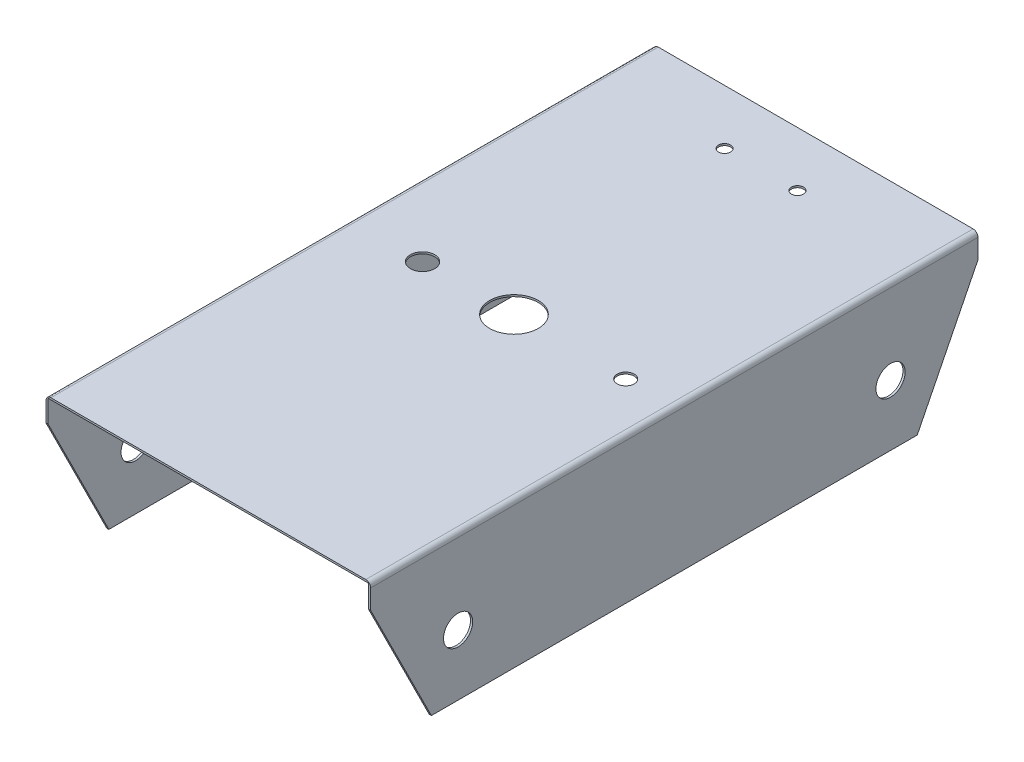
ISO-10303-21;
HEADER;
FILE_DESCRIPTION(('STEP AP214'),'2;1');
FILE_NAME('part.step','',(''),(''),'','','');
FILE_SCHEMA(('AUTOMOTIVE_DESIGN { 1 0 10303 214 1 1 1 1 }'));
ENDSEC;
DATA;
#1=APPLICATION_CONTEXT('core data for automotive mechanical design processes');
#2=APPLICATION_PROTOCOL_DEFINITION('international standard','automotive_design',2000,#1);
#3=PRODUCT_CONTEXT('',#1,'mechanical');
#4=PRODUCT('Part','Part','',(#3));
#5=PRODUCT_RELATED_PRODUCT_CATEGORY('part','',(#4));
#6=PRODUCT_DEFINITION_FORMATION('','',#4);
#7=PRODUCT_DEFINITION_CONTEXT('part definition',#1,'design');
#8=PRODUCT_DEFINITION('design','',#6,#7);
#9=PRODUCT_DEFINITION_SHAPE('','',#8);
#10=(LENGTH_UNIT() NAMED_UNIT(*) SI_UNIT(.MILLI.,.METRE.));
#11=(NAMED_UNIT(*) PLANE_ANGLE_UNIT() SI_UNIT($,.RADIAN.));
#12=(NAMED_UNIT(*) SI_UNIT($,.STERADIAN.) SOLID_ANGLE_UNIT());
#13=UNCERTAINTY_MEASURE_WITH_UNIT(LENGTH_MEASURE(1.E-05),#10,'distance_accuracy_value','');
#14=(GEOMETRIC_REPRESENTATION_CONTEXT(3) GLOBAL_UNCERTAINTY_ASSIGNED_CONTEXT((#13)) GLOBAL_UNIT_ASSIGNED_CONTEXT((#10,
#11,#12)) REPRESENTATION_CONTEXT('',''));
#15=CARTESIAN_POINT('',(0.,0.,0.));
#16=DIRECTION('',(0.,0.,1.));
#17=DIRECTION('',(1.,0.,0.));
#18=AXIS2_PLACEMENT_3D('',#15,#16,#17);
#19=CARTESIAN_POINT('',(-65.93,-60.,250.));
#20=DIRECTION('',(0.,1.,0.));
#21=DIRECTION('',(0.,0.,1.));
#22=AXIS2_PLACEMENT_3D('',#19,#20,#21);
#23=PLANE('',#22);
#24=DIRECTION('',(1.,0.,0.));
#25=VECTOR('',#24,1.);
#26=CARTESIAN_POINT('',(-183.19,-60.0000000000001,225.));
#27=LINE('',#26,#25);
#28=CARTESIAN_POINT('',(-66.81,-60.0000000000001,225.));
#29=VERTEX_POINT('',#28);
#30=CARTESIAN_POINT('',(-65.93,-60.0000000000001,225.));
#31=VERTEX_POINT('',#30);
#32=EDGE_CURVE('E148',#29,#31,#27,.T.);
#33=ORIENTED_EDGE('',*,*,#32,.F.);
#34=DIRECTION('',(0.,0.,-1.));
#35=VECTOR('',#34,1.);
#36=CARTESIAN_POINT('',(-66.81,-60.,250.));
#37=LINE('',#36,#35);
#38=CARTESIAN_POINT('',(-66.81,-60.0000000000001,25.));
#39=VERTEX_POINT('',#38);
#40=EDGE_CURVE('E161',#29,#39,#37,.T.);
#41=ORIENTED_EDGE('',*,*,#40,.T.);
#42=DIRECTION('',(1.,0.,0.));
#43=VECTOR('',#42,1.);
#44=CARTESIAN_POINT('',(-183.19,-60.0000000000001,25.));
#45=LINE('',#44,#43);
#46=CARTESIAN_POINT('',(-65.93,-60.0000000000001,25.));
#47=VERTEX_POINT('',#46);
#48=EDGE_CURVE('E155',#39,#47,#45,.T.);
#49=ORIENTED_EDGE('',*,*,#48,.T.);
#50=DIRECTION('',(0.,0.,-1.));
#51=VECTOR('',#50,1.);
#52=CARTESIAN_POINT('',(-65.93,-60.,250.));
#53=LINE('',#52,#51);
#54=EDGE_CURVE('E175',#31,#47,#53,.T.);
#55=ORIENTED_EDGE('',*,*,#54,.F.);
#56=EDGE_LOOP('',(#33,#41,#49,#55));
#57=FACE_BOUND('',#56,.T.);
#58=ADVANCED_FACE('F33',(#57),#23,.F.);
#59=CARTESIAN_POINT('',(-65.93,-0.750000000000023,250.));
#60=DIRECTION('',(-1.,0.,0.));
#61=DIRECTION('',(0.,-1.,0.));
#62=AXIS2_PLACEMENT_3D('',#59,#60,#61);
#63=PLANE('',#62);
#64=CARTESIAN_POINT('',(-65.93,-55.7,93.));
#65=DIRECTION('',(1.,0.,0.));
#66=DIRECTION('',(0.,1.,0.));
#67=AXIS2_PLACEMENT_3D('',#64,#65,#66);
#68=CIRCLE('',#67,2.5);
#69=CARTESIAN_POINT('',(-65.93,-53.2,93.));
#70=VERTEX_POINT('',#69);
#71=EDGE_CURVE('E627',#70,#70,#68,.T.);
#72=ORIENTED_EDGE('',*,*,#71,.F.);
#73=EDGE_LOOP('',(#72));
#74=FACE_BOUND('',#73,.T.);
#75=CARTESIAN_POINT('',(-65.93,-5.70000000000004,173.));
#76=DIRECTION('',(1.,0.,0.));
#77=DIRECTION('',(0.,1.,0.));
#78=AXIS2_PLACEMENT_3D('',#75,#76,#77);
#79=CIRCLE('',#78,2.5);
#80=CARTESIAN_POINT('',(-65.93,-3.20000000000005,173.));
#81=VERTEX_POINT('',#80);
#82=EDGE_CURVE('E626',#81,#81,#79,.T.);
#83=ORIENTED_EDGE('',*,*,#82,.F.);
#84=EDGE_LOOP('',(#83));
#85=FACE_BOUND('',#84,.T.);
#86=CARTESIAN_POINT('',(-65.93,-5.70000000000004,93.));
#87=DIRECTION('',(1.,0.,0.));
#88=DIRECTION('',(0.,1.,0.));
#89=AXIS2_PLACEMENT_3D('',#86,#87,#88);
#90=CIRCLE('',#89,2.5);
#91=CARTESIAN_POINT('',(-65.93,-3.20000000000005,93.));
#92=VERTEX_POINT('',#91);
#93=EDGE_CURVE('E623',#92,#92,#90,.T.);
#94=ORIENTED_EDGE('',*,*,#93,.F.);
#95=EDGE_LOOP('',(#94));
#96=FACE_BOUND('',#95,.T.);
#97=CARTESIAN_POINT('',(-65.93,-55.7,173.));
#98=DIRECTION('',(1.,0.,0.));
#99=DIRECTION('',(0.,1.,0.));
#100=AXIS2_PLACEMENT_3D('',#97,#98,#99);
#101=CIRCLE('',#100,2.5);
#102=CARTESIAN_POINT('',(-65.93,-53.2,173.));
#103=VERTEX_POINT('',#102);
#104=EDGE_CURVE('E203',#103,#103,#101,.T.);
#105=ORIENTED_EDGE('',*,*,#104,.F.);
#106=EDGE_LOOP('',(#105));
#107=FACE_BOUND('',#106,.T.);
#108=CARTESIAN_POINT('',(-65.93,-35.,214.));
#109=DIRECTION('',(-1.,0.,0.));
#110=DIRECTION('',(0.,-1.,0.));
#111=AXIS2_PLACEMENT_3D('',#108,#109,#110);
#112=CIRCLE('',#111,6.00000000000002);
#113=CARTESIAN_POINT('',(-65.93,-41.0000000000001,214.));
#114=VERTEX_POINT('',#113);
#115=EDGE_CURVE('E244',#114,#114,#112,.T.);
#116=ORIENTED_EDGE('',*,*,#115,.T.);
#117=EDGE_LOOP('',(#116));
#118=FACE_BOUND('',#117,.T.);
#119=CARTESIAN_POINT('',(-65.93,-35.,36.));
#120=DIRECTION('',(-1.,0.,0.));
#121=DIRECTION('',(0.,-1.,0.));
#122=AXIS2_PLACEMENT_3D('',#119,#120,#121);
#123=CIRCLE('',#122,6.);
#124=CARTESIAN_POINT('',(-65.93,-41.,36.));
#125=VERTEX_POINT('',#124);
#126=EDGE_CURVE('E235',#125,#125,#123,.T.);
#127=ORIENTED_EDGE('',*,*,#126,.T.);
#128=EDGE_LOOP('',(#127));
#129=FACE_BOUND('',#128,.T.);
#130=DIRECTION('',(0.,0.894427190999916,0.447213595499958));
#131=VECTOR('',#130,1.);
#132=CARTESIAN_POINT('',(-65.93,-2.60000000000002,253.7));
#133=LINE('',#132,#131);
#134=CARTESIAN_POINT('',(-65.93,-10.,250.));
#135=VERTEX_POINT('',#134);
#136=EDGE_CURVE('E262',#31,#135,#133,.T.);
#137=ORIENTED_EDGE('',*,*,#136,.F.);
#138=ORIENTED_EDGE('',*,*,#54,.T.);
#139=DIRECTION('',(0.,0.894427190999916,-0.447213595499958));
#140=VECTOR('',#139,1.);
#141=CARTESIAN_POINT('',(-65.93,-102.6,46.3000000000001));
#142=LINE('',#141,#140);
#143=CARTESIAN_POINT('',(-65.93,-10.,0.));
#144=VERTEX_POINT('',#143);
#145=EDGE_CURVE('E256',#47,#144,#142,.T.);
#146=ORIENTED_EDGE('',*,*,#145,.T.);
#147=DIRECTION('',(0.,1.,0.));
#148=VECTOR('',#147,1.);
#149=CARTESIAN_POINT('',(-65.93,-0.750000000000023,0.));
#150=LINE('',#149,#148);
#151=CARTESIAN_POINT('',(-65.93,-0.750000000000023,0.));
#152=VERTEX_POINT('',#151);
#153=EDGE_CURVE('E264',#144,#152,#150,.T.);
#154=ORIENTED_EDGE('',*,*,#153,.T.);
#155=DIRECTION('',(0.,0.,-1.));
#156=VECTOR('',#155,1.);
#157=CARTESIAN_POINT('',(-65.93,-0.750000000000023,250.));
#158=LINE('',#157,#156);
#159=CARTESIAN_POINT('',(-65.93,-0.750000000000023,250.));
#160=VERTEX_POINT('',#159);
#161=EDGE_CURVE('E172',#160,#152,#158,.T.);
#162=ORIENTED_EDGE('',*,*,#161,.F.);
#163=DIRECTION('',(0.,1.,0.));
#164=VECTOR('',#163,1.);
#165=CARTESIAN_POINT('',(-65.93,-0.750000000000023,250.));
#166=LINE('',#165,#164);
#167=EDGE_CURVE('E265',#135,#160,#166,.T.);
#168=ORIENTED_EDGE('',*,*,#167,.F.);
#169=EDGE_LOOP('',(#137,#138,#146,#154,#162,#168));
#170=FACE_BOUND('',#169,.T.);
#171=ADVANCED_FACE('F305',(#74,#85,#96,#107,#118,#129,#170),#63,.F.);
#172=CARTESIAN_POINT('',(65.93,-60.,250.));
#173=DIRECTION('',(1.,0.,0.));
#174=DIRECTION('',(0.,0.,-1.));
#175=AXIS2_PLACEMENT_3D('',#172,#173,#174);
#176=PLANE('',#175);
#177=CARTESIAN_POINT('',(65.93,-35.,214.));
#178=DIRECTION('',(1.,0.,0.));
#179=DIRECTION('',(0.,0.,-1.));
#180=AXIS2_PLACEMENT_3D('',#177,#178,#179);
#181=CIRCLE('',#180,6.00000000000002);
#182=CARTESIAN_POINT('',(65.93,-35.,208.));
#183=VERTEX_POINT('',#182);
#184=EDGE_CURVE('E241',#183,#183,#181,.T.);
#185=ORIENTED_EDGE('',*,*,#184,.T.);
#186=EDGE_LOOP('',(#185));
#187=FACE_BOUND('',#186,.T.);
#188=CARTESIAN_POINT('',(65.93,-35.,36.));
#189=DIRECTION('',(1.,0.,0.));
#190=DIRECTION('',(0.,0.,-1.));
#191=AXIS2_PLACEMENT_3D('',#188,#189,#190);
#192=CIRCLE('',#191,6.);
#193=CARTESIAN_POINT('',(65.93,-35.,30.));
#194=VERTEX_POINT('',#193);
#195=EDGE_CURVE('E232',#194,#194,#192,.T.);
#196=ORIENTED_EDGE('',*,*,#195,.T.);
#197=EDGE_LOOP('',(#196));
#198=FACE_BOUND('',#197,.T.);
#199=DIRECTION('',(0.,-0.894427190999916,-0.447213595499958));
#200=VECTOR('',#199,1.);
#201=CARTESIAN_POINT('',(65.93,-50.,230.));
#202=LINE('',#201,#200);
#203=CARTESIAN_POINT('',(65.93,-10.,250.));
#204=VERTEX_POINT('',#203);
#205=CARTESIAN_POINT('',(65.93,-60.0000000000001,225.));
#206=VERTEX_POINT('',#205);
#207=EDGE_CURVE('E143',#204,#206,#202,.T.);
#208=ORIENTED_EDGE('',*,*,#207,.F.);
#209=DIRECTION('',(0.,-1.,0.));
#210=VECTOR('',#209,1.);
#211=CARTESIAN_POINT('',(65.93,-60.,250.));
#212=LINE('',#211,#210);
#213=CARTESIAN_POINT('',(65.93,-0.749999999999973,250.));
#214=VERTEX_POINT('',#213);
#215=EDGE_CURVE('E270',#214,#204,#212,.T.);
#216=ORIENTED_EDGE('',*,*,#215,.F.);
#217=DIRECTION('',(0.,0.,-1.));
#218=VECTOR('',#217,1.);
#219=CARTESIAN_POINT('',(65.93,-0.749999999999973,250.));
#220=LINE('',#219,#218);
#221=CARTESIAN_POINT('',(65.93,-0.749999999999973,0.));
#222=VERTEX_POINT('',#221);
#223=EDGE_CURVE('E163',#214,#222,#220,.T.);
#224=ORIENTED_EDGE('',*,*,#223,.T.);
#225=DIRECTION('',(0.,-1.,0.));
#226=VECTOR('',#225,1.);
#227=CARTESIAN_POINT('',(65.93,-60.,0.));
#228=LINE('',#227,#226);
#229=CARTESIAN_POINT('',(65.93,-10.,0.));
#230=VERTEX_POINT('',#229);
#231=EDGE_CURVE('E280',#222,#230,#228,.T.);
#232=ORIENTED_EDGE('',*,*,#231,.T.);
#233=DIRECTION('',(0.,-0.894427190999916,0.447213595499958));
#234=VECTOR('',#233,1.);
#235=CARTESIAN_POINT('',(65.93,-150.,70.0000000000001));
#236=LINE('',#235,#234);
#237=CARTESIAN_POINT('',(65.93,-60.0000000000001,25.));
#238=VERTEX_POINT('',#237);
#239=EDGE_CURVE('E253',#230,#238,#236,.T.);
#240=ORIENTED_EDGE('',*,*,#239,.T.);
#241=DIRECTION('',(0.,0.,-1.));
#242=VECTOR('',#241,1.);
#243=CARTESIAN_POINT('',(65.93,-60.,250.));
#244=LINE('',#243,#242);
#245=EDGE_CURVE('E160',#206,#238,#244,.T.);
#246=ORIENTED_EDGE('',*,*,#245,.F.);
#247=EDGE_LOOP('',(#208,#216,#224,#232,#240,#246));
#248=FACE_BOUND('',#247,.T.);
#249=ADVANCED_FACE('F336',(#187,#198,#248),#176,.F.);
#250=CARTESIAN_POINT('',(66.81,-60.0000000000001,250.));
#251=DIRECTION('',(0.,1.,0.));
#252=DIRECTION('',(-1.,0.,0.));
#253=AXIS2_PLACEMENT_3D('',#250,#251,#252);
#254=PLANE('',#253);
#255=CARTESIAN_POINT('',(66.81,-60.0000000000001,225.));
#256=VERTEX_POINT('',#255);
#257=EDGE_CURVE('E137',#206,#256,#27,.T.);
#258=ORIENTED_EDGE('',*,*,#257,.F.);
#259=ORIENTED_EDGE('',*,*,#245,.T.);
#260=CARTESIAN_POINT('',(66.81,-60.0000000000001,25.));
#261=VERTEX_POINT('',#260);
#262=EDGE_CURVE('E159',#238,#261,#45,.T.);
#263=ORIENTED_EDGE('',*,*,#262,.T.);
#264=DIRECTION('',(0.,0.,-1.));
#265=VECTOR('',#264,1.);
#266=CARTESIAN_POINT('',(66.81,-60.0000000000001,250.));
#267=LINE('',#266,#265);
#268=EDGE_CURVE('E153',#256,#261,#267,.T.);
#269=ORIENTED_EDGE('',*,*,#268,.F.);
#270=EDGE_LOOP('',(#258,#259,#263,#269));
#271=FACE_BOUND('',#270,.T.);
#272=ADVANCED_FACE('F158',(#271),#254,.F.);
#273=CARTESIAN_POINT('',(66.81,0.,250.));
#274=DIRECTION('',(-1.,0.,0.));
#275=DIRECTION('',(0.,-1.,0.));
#276=AXIS2_PLACEMENT_3D('',#273,#274,#275);
#277=PLANE('',#276);
#278=CARTESIAN_POINT('',(66.81,-35.,214.));
#279=DIRECTION('',(-1.,0.,0.));
#280=DIRECTION('',(0.,-1.,0.));
#281=AXIS2_PLACEMENT_3D('',#278,#279,#280);
#282=CIRCLE('',#281,6.00000000000002);
#283=CARTESIAN_POINT('',(66.81,-41.,214.));
#284=VERTEX_POINT('',#283);
#285=EDGE_CURVE('E238',#284,#284,#282,.T.);
#286=ORIENTED_EDGE('',*,*,#285,.T.);
#287=EDGE_LOOP('',(#286));
#288=FACE_BOUND('',#287,.T.);
#289=CARTESIAN_POINT('',(66.81,-35.,36.));
#290=DIRECTION('',(-1.,0.,0.));
#291=DIRECTION('',(0.,-1.,0.));
#292=AXIS2_PLACEMENT_3D('',#289,#290,#291);
#293=CIRCLE('',#292,6.);
#294=CARTESIAN_POINT('',(66.81,-41.,36.));
#295=VERTEX_POINT('',#294);
#296=EDGE_CURVE('E227',#295,#295,#293,.T.);
#297=ORIENTED_EDGE('',*,*,#296,.T.);
#298=EDGE_LOOP('',(#297));
#299=FACE_BOUND('',#298,.T.);
#300=DIRECTION('',(0.,1.,0.));
#301=VECTOR('',#300,1.);
#302=CARTESIAN_POINT('',(66.81,0.,0.));
#303=LINE('',#302,#301);
#304=CARTESIAN_POINT('',(66.81,-10.,0.));
#305=VERTEX_POINT('',#304);
#306=CARTESIAN_POINT('',(66.81,-2.00000000000006,0.));
#307=VERTEX_POINT('',#306);
#308=EDGE_CURVE('E283',#305,#307,#303,.T.);
#309=ORIENTED_EDGE('',*,*,#308,.T.);
#310=DIRECTION('',(0.,0.,-1.));
#311=VECTOR('',#310,1.);
#312=CARTESIAN_POINT('',(66.81,-2.00000000000006,250.));
#313=LINE('',#312,#311);
#314=CARTESIAN_POINT('',(66.81,-2.00000000000006,250.));
#315=VERTEX_POINT('',#314);
#316=EDGE_CURVE('E11',#307,#315,#313,.F.);
#317=ORIENTED_EDGE('',*,*,#316,.T.);
#318=DIRECTION('',(0.,1.,0.));
#319=VECTOR('',#318,1.);
#320=CARTESIAN_POINT('',(66.81,0.,250.));
#321=LINE('',#320,#319);
#322=CARTESIAN_POINT('',(66.81,-10.,250.));
#323=VERTEX_POINT('',#322);
#324=EDGE_CURVE('E154',#323,#315,#321,.T.);
#325=ORIENTED_EDGE('',*,*,#324,.F.);
#326=DIRECTION('',(0.,-0.894427190999916,-0.447213595499958));
#327=VECTOR('',#326,1.);
#328=CARTESIAN_POINT('',(66.81,-102.,204.));
#329=LINE('',#328,#327);
#330=EDGE_CURVE('E140',#323,#256,#329,.T.);
#331=ORIENTED_EDGE('',*,*,#330,.T.);
#332=ORIENTED_EDGE('',*,*,#268,.T.);
#333=DIRECTION('',(0.,-0.894427190999916,0.447213595499958));
#334=VECTOR('',#333,1.);
#335=CARTESIAN_POINT('',(66.81,-1.99999999999999,-4.00000000000001));
#336=LINE('',#335,#334);
#337=EDGE_CURVE('E246',#305,#261,#336,.T.);
#338=ORIENTED_EDGE('',*,*,#337,.F.);
#339=EDGE_LOOP('',(#309,#317,#325,#331,#332,#338));
#340=FACE_BOUND('',#339,.T.);
#341=ADVANCED_FACE('F151',(#288,#299,#340),#277,.F.);
#342=CARTESIAN_POINT('',(-66.81,-60.,250.));
#343=DIRECTION('',(1.,0.,0.));
#344=DIRECTION('',(0.,0.,-1.));
#345=AXIS2_PLACEMENT_3D('',#342,#343,#344);
#346=PLANE('',#345);
#347=CARTESIAN_POINT('',(-66.81,-55.7,93.));
#348=DIRECTION('',(1.,0.,0.));
#349=DIRECTION('',(0.,0.,-1.));
#350=AXIS2_PLACEMENT_3D('',#347,#348,#349);
#351=CIRCLE('',#350,2.5);
#352=CARTESIAN_POINT('',(-66.81,-55.7,90.5));
#353=VERTEX_POINT('',#352);
#354=EDGE_CURVE('E37',#353,#353,#351,.T.);
#355=ORIENTED_EDGE('',*,*,#354,.T.);
#356=EDGE_LOOP('',(#355));
#357=FACE_BOUND('',#356,.T.);
#358=CARTESIAN_POINT('',(-66.81,-5.70000000000004,173.));
#359=DIRECTION('',(1.,0.,0.));
#360=DIRECTION('',(0.,0.,-1.));
#361=AXIS2_PLACEMENT_3D('',#358,#359,#360);
#362=CIRCLE('',#361,2.5);
#363=CARTESIAN_POINT('',(-66.81,-5.70000000000004,170.5));
#364=VERTEX_POINT('',#363);
#365=EDGE_CURVE('E205',#364,#364,#362,.T.);
#366=ORIENTED_EDGE('',*,*,#365,.T.);
#367=EDGE_LOOP('',(#366));
#368=FACE_BOUND('',#367,.T.);
#369=CARTESIAN_POINT('',(-66.81,-5.70000000000004,93.));
#370=DIRECTION('',(1.,0.,0.));
#371=DIRECTION('',(0.,0.,-1.));
#372=AXIS2_PLACEMENT_3D('',#369,#370,#371);
#373=CIRCLE('',#372,2.5);
#374=CARTESIAN_POINT('',(-66.81,-5.70000000000004,90.5));
#375=VERTEX_POINT('',#374);
#376=EDGE_CURVE('E202',#375,#375,#373,.T.);
#377=ORIENTED_EDGE('',*,*,#376,.T.);
#378=EDGE_LOOP('',(#377));
#379=FACE_BOUND('',#378,.T.);
#380=CARTESIAN_POINT('',(-66.81,-55.7,173.));
#381=DIRECTION('',(1.,0.,0.));
#382=DIRECTION('',(0.,0.,-1.));
#383=AXIS2_PLACEMENT_3D('',#380,#381,#382);
#384=CIRCLE('',#383,2.5);
#385=CARTESIAN_POINT('',(-66.81,-55.7,170.5));
#386=VERTEX_POINT('',#385);
#387=EDGE_CURVE('E199',#386,#386,#384,.T.);
#388=ORIENTED_EDGE('',*,*,#387,.T.);
#389=EDGE_LOOP('',(#388));
#390=FACE_BOUND('',#389,.T.);
#391=CARTESIAN_POINT('',(-66.81,-35.,214.));
#392=DIRECTION('',(1.,0.,0.));
#393=DIRECTION('',(0.,1.,0.));
#394=AXIS2_PLACEMENT_3D('',#391,#392,#393);
#395=CIRCLE('',#394,6.00000000000002);
#396=CARTESIAN_POINT('',(-66.81,-29.,214.));
#397=VERTEX_POINT('',#396);
#398=EDGE_CURVE('E224',#397,#397,#395,.T.);
#399=ORIENTED_EDGE('',*,*,#398,.T.);
#400=EDGE_LOOP('',(#399));
#401=FACE_BOUND('',#400,.T.);
#402=CARTESIAN_POINT('',(-66.81,-35.,36.));
#403=DIRECTION('',(1.,0.,0.));
#404=DIRECTION('',(0.,1.,0.));
#405=AXIS2_PLACEMENT_3D('',#402,#403,#404);
#406=CIRCLE('',#405,6.);
#407=CARTESIAN_POINT('',(-66.81,-29.0000000000001,36.));
#408=VERTEX_POINT('',#407);
#409=EDGE_CURVE('E219',#408,#408,#406,.T.);
#410=ORIENTED_EDGE('',*,*,#409,.T.);
#411=EDGE_LOOP('',(#410));
#412=FACE_BOUND('',#411,.T.);
#413=DIRECTION('',(0.,-1.,0.));
#414=VECTOR('',#413,1.);
#415=CARTESIAN_POINT('',(-66.81,-60.,250.));
#416=LINE('',#415,#414);
#417=CARTESIAN_POINT('',(-66.81,-1.99999999999999,250.));
#418=VERTEX_POINT('',#417);
#419=CARTESIAN_POINT('',(-66.81,-10.,250.));
#420=VERTEX_POINT('',#419);
#421=EDGE_CURVE('E166',#418,#420,#416,.T.);
#422=ORIENTED_EDGE('',*,*,#421,.F.);
#423=DIRECTION('',(0.,0.,-1.));
#424=VECTOR('',#423,1.);
#425=CARTESIAN_POINT('',(-66.81,-1.99999999999999,250.));
#426=LINE('',#425,#424);
#427=CARTESIAN_POINT('',(-66.81,-1.99999999999999,0.));
#428=VERTEX_POINT('',#427);
#429=EDGE_CURVE('E185',#418,#428,#426,.T.);
#430=ORIENTED_EDGE('',*,*,#429,.T.);
#431=DIRECTION('',(0.,-1.,0.));
#432=VECTOR('',#431,1.);
#433=CARTESIAN_POINT('',(-66.81,-60.,0.));
#434=LINE('',#433,#432);
#435=CARTESIAN_POINT('',(-66.81,-10.,0.));
#436=VERTEX_POINT('',#435);
#437=EDGE_CURVE('E268',#428,#436,#434,.T.);
#438=ORIENTED_EDGE('',*,*,#437,.T.);
#439=DIRECTION('',(0.,-0.894427190999916,0.447213595499958));
#440=VECTOR('',#439,1.);
#441=CARTESIAN_POINT('',(-66.81,-150.,70.0000000000001));
#442=LINE('',#441,#440);
#443=EDGE_CURVE('E250',#436,#39,#442,.T.);
#444=ORIENTED_EDGE('',*,*,#443,.T.);
#445=ORIENTED_EDGE('',*,*,#40,.F.);
#446=DIRECTION('',(0.,-0.894427190999916,-0.447213595499958));
#447=VECTOR('',#446,1.);
#448=CARTESIAN_POINT('',(-66.81,-50.,230.));
#449=LINE('',#448,#447);
#450=EDGE_CURVE('E259',#420,#29,#449,.T.);
#451=ORIENTED_EDGE('',*,*,#450,.F.);
#452=EDGE_LOOP('',(#422,#430,#438,#444,#445,#451));
#453=FACE_BOUND('',#452,.T.);
#454=ADVANCED_FACE('F290',(#357,#368,#379,#390,#401,#412,#453),#346,.F.);
#455=CARTESIAN_POINT('',(0.,0.,250.));
#456=DIRECTION('',(0.,0.,-1.));
#457=DIRECTION('',(-1.,0.,0.));
#458=AXIS2_PLACEMENT_3D('',#455,#456,#457);
#459=PLANE('',#458);
#460=DIRECTION('',(-1.,0.,0.));
#461=VECTOR('',#460,1.);
#462=CARTESIAN_POINT('',(-66.81,0.,250.));
#463=LINE('',#462,#461);
#464=CARTESIAN_POINT('',(64.81,0.,250.));
#465=VERTEX_POINT('',#464);
#466=CARTESIAN_POINT('',(-64.81,0.,250.));
#467=VERTEX_POINT('',#466);
#468=EDGE_CURVE('E274',#465,#467,#463,.T.);
#469=ORIENTED_EDGE('',*,*,#468,.T.);
#470=CARTESIAN_POINT('',(-64.81,-1.99999999999999,250.));
#471=DIRECTION('',(0.,0.,-1.));
#472=DIRECTION('',(-1.,0.,0.));
#473=AXIS2_PLACEMENT_3D('',#470,#471,#472);
#474=CIRCLE('',#473,2.);
#475=EDGE_CURVE('E42',#467,#418,#474,.F.);
#476=ORIENTED_EDGE('',*,*,#475,.T.);
#477=ORIENTED_EDGE('',*,*,#421,.T.);
#478=DIRECTION('',(-1.,0.,0.));
#479=VECTOR('',#478,1.);
#480=CARTESIAN_POINT('',(0.,-10.,250.));
#481=LINE('',#480,#479);
#482=EDGE_CURVE('E181',#135,#420,#481,.T.);
#483=ORIENTED_EDGE('',*,*,#482,.F.);
#484=ORIENTED_EDGE('',*,*,#167,.T.);
#485=DIRECTION('',(1.,0.,0.));
#486=VECTOR('',#485,1.);
#487=CARTESIAN_POINT('',(65.93,-0.749999999999973,250.));
#488=LINE('',#487,#486);
#489=EDGE_CURVE('E267',#160,#214,#488,.T.);
#490=ORIENTED_EDGE('',*,*,#489,.T.);
#491=ORIENTED_EDGE('',*,*,#215,.T.);
#492=EDGE_CURVE('E184',#323,#204,#481,.T.);
#493=ORIENTED_EDGE('',*,*,#492,.F.);
#494=ORIENTED_EDGE('',*,*,#324,.T.);
#495=CARTESIAN_POINT('',(64.81,-2.00000000000006,250.));
#496=DIRECTION('',(0.,0.,-1.));
#497=DIRECTION('',(-1.,0.,0.));
#498=AXIS2_PLACEMENT_3D('',#495,#496,#497);
#499=CIRCLE('',#498,2.);
#500=EDGE_CURVE('E196',#315,#465,#499,.F.);
#501=ORIENTED_EDGE('',*,*,#500,.T.);
#502=EDGE_LOOP('',(#469,#476,#477,#483,#484,#490,#491,#493,#494,#501));
#503=FACE_BOUND('',#502,.T.);
#504=ADVANCED_FACE('F313',(#503),#459,.F.);
#505=CARTESIAN_POINT('',(65.93,-0.749999999999973,250.));
#506=DIRECTION('',(0.,1.,0.));
#507=DIRECTION('',(-1.,0.,0.));
#508=AXIS2_PLACEMENT_3D('',#505,#506,#507);
#509=PLANE('',#508);
#510=CARTESIAN_POINT('',(-15.,-0.750000000000004,22.5));
#511=DIRECTION('',(0.,1.,0.));
#512=DIRECTION('',(-1.,0.,0.));
#513=AXIS2_PLACEMENT_3D('',#510,#511,#512);
#514=CIRCLE('',#513,2.5);
#515=CARTESIAN_POINT('',(-17.5,-0.750000000000005,22.5));
#516=VERTEX_POINT('',#515);
#517=EDGE_CURVE('E384',#516,#516,#514,.T.);
#518=ORIENTED_EDGE('',*,*,#517,.T.);
#519=EDGE_LOOP('',(#518));
#520=FACE_BOUND('',#519,.T.);
#521=CARTESIAN_POINT('',(15.,-0.749999999999992,22.5));
#522=DIRECTION('',(0.,1.,0.));
#523=DIRECTION('',(-1.,0.,0.));
#524=AXIS2_PLACEMENT_3D('',#521,#522,#523);
#525=CIRCLE('',#524,2.5);
#526=CARTESIAN_POINT('',(12.5,-0.749999999999993,22.5));
#527=VERTEX_POINT('',#526);
#528=EDGE_CURVE('E388',#527,#527,#525,.T.);
#529=ORIENTED_EDGE('',*,*,#528,.T.);
#530=EDGE_LOOP('',(#529));
#531=FACE_BOUND('',#530,.T.);
#532=CARTESIAN_POINT('',(46.81,-0.74999999999998,125.));
#533=DIRECTION('',(0.,1.,0.));
#534=DIRECTION('',(-1.,0.,0.));
#535=AXIS2_PLACEMENT_3D('',#532,#533,#534);
#536=CIRCLE('',#535,3.5);
#537=CARTESIAN_POINT('',(43.31,-0.749999999999981,125.));
#538=VERTEX_POINT('',#537);
#539=EDGE_CURVE('E392',#538,#538,#536,.T.);
#540=ORIENTED_EDGE('',*,*,#539,.T.);
#541=EDGE_LOOP('',(#540));
#542=FACE_BOUND('',#541,.T.);
#543=CARTESIAN_POINT('',(-36.81,-0.750000000000013,125.));
#544=DIRECTION('',(0.,1.,0.));
#545=DIRECTION('',(-1.,0.,0.));
#546=AXIS2_PLACEMENT_3D('',#543,#544,#545);
#547=CIRCLE('',#546,5.);
#548=CARTESIAN_POINT('',(-41.81,-0.750000000000015,125.));
#549=VERTEX_POINT('',#548);
#550=EDGE_CURVE('E396',#549,#549,#547,.T.);
#551=ORIENTED_EDGE('',*,*,#550,.T.);
#552=EDGE_LOOP('',(#551));
#553=FACE_BOUND('',#552,.T.);
#554=CARTESIAN_POINT('',(0.810000000000005,-0.749999999999997,125.));
#555=DIRECTION('',(0.,1.,0.));
#556=DIRECTION('',(-1.,0.,0.));
#557=AXIS2_PLACEMENT_3D('',#554,#555,#556);
#558=CIRCLE('',#557,10.);
#559=CARTESIAN_POINT('',(-9.18999999999999,-0.750000000000001,125.));
#560=VERTEX_POINT('',#559);
#561=EDGE_CURVE('E214',#560,#560,#558,.T.);
#562=ORIENTED_EDGE('',*,*,#561,.T.);
#563=EDGE_LOOP('',(#562));
#564=FACE_BOUND('',#563,.T.);
#565=DIRECTION('',(1.,0.,0.));
#566=VECTOR('',#565,1.);
#567=CARTESIAN_POINT('',(65.93,-0.749999999999973,0.));
#568=LINE('',#567,#566);
#569=EDGE_CURVE('E278',#152,#222,#568,.T.);
#570=ORIENTED_EDGE('',*,*,#569,.T.);
#571=ORIENTED_EDGE('',*,*,#223,.F.);
#572=ORIENTED_EDGE('',*,*,#489,.F.);
#573=ORIENTED_EDGE('',*,*,#161,.T.);
#574=EDGE_LOOP('',(#570,#571,#572,#573));
#575=FACE_BOUND('',#574,.T.);
#576=ADVANCED_FACE('F309',(#520,#531,#542,#553,#564,#575),#509,.F.);
#577=CARTESIAN_POINT('',(-66.81,0.,250.));
#578=DIRECTION('',(0.,-1.,0.));
#579=DIRECTION('',(1.,0.,0.));
#580=AXIS2_PLACEMENT_3D('',#577,#578,#579);
#581=PLANE('',#580);
#582=CARTESIAN_POINT('',(-15.,0.,22.5));
#583=DIRECTION('',(0.,1.,0.));
#584=DIRECTION('',(-1.,0.,0.));
#585=AXIS2_PLACEMENT_3D('',#582,#583,#584);
#586=CIRCLE('',#585,2.5);
#587=CARTESIAN_POINT('',(-17.5,0.,22.5));
#588=VERTEX_POINT('',#587);
#589=EDGE_CURVE('E610',#588,#588,#586,.T.);
#590=ORIENTED_EDGE('',*,*,#589,.F.);
#591=EDGE_LOOP('',(#590));
#592=FACE_BOUND('',#591,.T.);
#593=CARTESIAN_POINT('',(15.,0.,22.5));
#594=DIRECTION('',(0.,1.,0.));
#595=DIRECTION('',(-1.,0.,0.));
#596=AXIS2_PLACEMENT_3D('',#593,#594,#595);
#597=CIRCLE('',#596,2.5);
#598=CARTESIAN_POINT('',(12.5,0.,22.5));
#599=VERTEX_POINT('',#598);
#600=EDGE_CURVE('E661',#599,#599,#597,.T.);
#601=ORIENTED_EDGE('',*,*,#600,.F.);
#602=EDGE_LOOP('',(#601));
#603=FACE_BOUND('',#602,.T.);
#604=CARTESIAN_POINT('',(46.81,0.,125.));
#605=DIRECTION('',(0.,1.,0.));
#606=DIRECTION('',(-1.,0.,0.));
#607=AXIS2_PLACEMENT_3D('',#604,#605,#606);
#608=CIRCLE('',#607,3.5);
#609=CARTESIAN_POINT('',(43.31,0.,125.));
#610=VERTEX_POINT('',#609);
#611=EDGE_CURVE('E614',#610,#610,#608,.T.);
#612=ORIENTED_EDGE('',*,*,#611,.F.);
#613=EDGE_LOOP('',(#612));
#614=FACE_BOUND('',#613,.T.);
#615=CARTESIAN_POINT('',(-36.81,0.,125.));
#616=DIRECTION('',(0.,1.,0.));
#617=DIRECTION('',(-1.,0.,0.));
#618=AXIS2_PLACEMENT_3D('',#615,#616,#617);
#619=CIRCLE('',#618,5.);
#620=CARTESIAN_POINT('',(-41.81,0.,125.));
#621=VERTEX_POINT('',#620);
#622=EDGE_CURVE('E611',#621,#621,#619,.T.);
#623=ORIENTED_EDGE('',*,*,#622,.F.);
#624=EDGE_LOOP('',(#623));
#625=FACE_BOUND('',#624,.T.);
#626=CARTESIAN_POINT('',(0.810000000000005,0.,125.));
#627=DIRECTION('',(0.,1.,0.));
#628=DIRECTION('',(-1.,0.,0.));
#629=AXIS2_PLACEMENT_3D('',#626,#627,#628);
#630=CIRCLE('',#629,10.);
#631=CARTESIAN_POINT('',(-9.18999999999999,0.,125.));
#632=VERTEX_POINT('',#631);
#633=EDGE_CURVE('E210',#632,#632,#630,.T.);
#634=ORIENTED_EDGE('',*,*,#633,.F.);
#635=EDGE_LOOP('',(#634));
#636=FACE_BOUND('',#635,.T.);
#637=DIRECTION('',(-1.,0.,0.));
#638=VECTOR('',#637,1.);
#639=CARTESIAN_POINT('',(-66.81,0.,0.));
#640=LINE('',#639,#638);
#641=CARTESIAN_POINT('',(64.81,0.,0.));
#642=VERTEX_POINT('',#641);
#643=CARTESIAN_POINT('',(-64.81,0.,0.));
#644=VERTEX_POINT('',#643);
#645=EDGE_CURVE('E285',#642,#644,#640,.T.);
#646=ORIENTED_EDGE('',*,*,#645,.T.);
#647=DIRECTION('',(0.,0.,-1.));
#648=VECTOR('',#647,1.);
#649=CARTESIAN_POINT('',(-64.81,0.,250.));
#650=LINE('',#649,#648);
#651=EDGE_CURVE('E56',#644,#467,#650,.F.);
#652=ORIENTED_EDGE('',*,*,#651,.T.);
#653=ORIENTED_EDGE('',*,*,#468,.F.);
#654=DIRECTION('',(0.,0.,-1.));
#655=VECTOR('',#654,1.);
#656=CARTESIAN_POINT('',(64.81,0.,250.));
#657=LINE('',#656,#655);
#658=EDGE_CURVE('E192',#465,#642,#657,.T.);
#659=ORIENTED_EDGE('',*,*,#658,.T.);
#660=EDGE_LOOP('',(#646,#652,#653,#659));
#661=FACE_BOUND('',#660,.T.);
#662=ADVANCED_FACE('F357',(#592,#603,#614,#625,#636,#661),#581,.F.);
#663=CARTESIAN_POINT('',(0.,0.,0.));
#664=DIRECTION('',(0.,0.,-1.));
#665=DIRECTION('',(-1.,0.,0.));
#666=AXIS2_PLACEMENT_3D('',#663,#664,#665);
#667=PLANE('',#666);
#668=ORIENTED_EDGE('',*,*,#437,.F.);
#669=CARTESIAN_POINT('',(-64.81,-1.99999999999999,0.));
#670=DIRECTION('',(0.,0.,-1.));
#671=DIRECTION('',(-1.,0.,0.));
#672=AXIS2_PLACEMENT_3D('',#669,#670,#671);
#673=CIRCLE('',#672,2.);
#674=EDGE_CURVE('E190',#428,#644,#673,.T.);
#675=ORIENTED_EDGE('',*,*,#674,.T.);
#676=ORIENTED_EDGE('',*,*,#645,.F.);
#677=CARTESIAN_POINT('',(64.81,-2.00000000000006,0.));
#678=DIRECTION('',(0.,0.,-1.));
#679=DIRECTION('',(-1.,0.,0.));
#680=AXIS2_PLACEMENT_3D('',#677,#678,#679);
#681=CIRCLE('',#680,2.);
#682=EDGE_CURVE('E188',#642,#307,#681,.T.);
#683=ORIENTED_EDGE('',*,*,#682,.T.);
#684=ORIENTED_EDGE('',*,*,#308,.F.);
#685=DIRECTION('',(1.,0.,0.));
#686=VECTOR('',#685,1.);
#687=CARTESIAN_POINT('',(0.,-10.,0.));
#688=LINE('',#687,#686);
#689=EDGE_CURVE('E178',#230,#305,#688,.T.);
#690=ORIENTED_EDGE('',*,*,#689,.F.);
#691=ORIENTED_EDGE('',*,*,#231,.F.);
#692=ORIENTED_EDGE('',*,*,#569,.F.);
#693=ORIENTED_EDGE('',*,*,#153,.F.);
#694=EDGE_CURVE('E180',#436,#144,#688,.T.);
#695=ORIENTED_EDGE('',*,*,#694,.F.);
#696=EDGE_LOOP('',(#668,#675,#676,#683,#684,#690,#691,#692,#693,#695));
#697=FACE_BOUND('',#696,.T.);
#698=ADVANCED_FACE('F299',(#697),#667,.T.);
#699=CARTESIAN_POINT('',(-183.19,-2.00000000000005,-4.00000000000001));
#700=DIRECTION('',(0.,0.447213595499958,0.894427190999916));
#701=DIRECTION('',(0.,-0.894427190999916,0.447213595499958));
#702=AXIS2_PLACEMENT_3D('',#699,#700,#701);
#703=PLANE('',#702);
#704=ORIENTED_EDGE('',*,*,#689,.T.);
#705=ORIENTED_EDGE('',*,*,#337,.T.);
#706=ORIENTED_EDGE('',*,*,#262,.F.);
#707=ORIENTED_EDGE('',*,*,#239,.F.);
#708=EDGE_LOOP('',(#704,#705,#706,#707));
#709=FACE_BOUND('',#708,.T.);
#710=ADVANCED_FACE('F328',(#709),#703,.F.);
#711=ORIENTED_EDGE('',*,*,#48,.F.);
#712=ORIENTED_EDGE('',*,*,#443,.F.);
#713=ORIENTED_EDGE('',*,*,#694,.T.);
#714=ORIENTED_EDGE('',*,*,#145,.F.);
#715=EDGE_LOOP('',(#711,#712,#713,#714));
#716=FACE_BOUND('',#715,.T.);
#717=ADVANCED_FACE('F296',(#716),#703,.F.);
#718=CARTESIAN_POINT('',(-183.19,-102.,204.));
#719=DIRECTION('',(0.,-0.447213595499958,0.894427190999916));
#720=DIRECTION('',(0.,-0.894427190999916,-0.447213595499958));
#721=AXIS2_PLACEMENT_3D('',#718,#719,#720);
#722=PLANE('',#721);
#723=ORIENTED_EDGE('',*,*,#136,.T.);
#724=ORIENTED_EDGE('',*,*,#482,.T.);
#725=ORIENTED_EDGE('',*,*,#450,.T.);
#726=ORIENTED_EDGE('',*,*,#32,.T.);
#727=EDGE_LOOP('',(#723,#724,#725,#726));
#728=FACE_BOUND('',#727,.T.);
#729=ADVANCED_FACE('F320',(#728),#722,.T.);
#730=ORIENTED_EDGE('',*,*,#207,.T.);
#731=ORIENTED_EDGE('',*,*,#257,.T.);
#732=ORIENTED_EDGE('',*,*,#330,.F.);
#733=ORIENTED_EDGE('',*,*,#492,.T.);
#734=EDGE_LOOP('',(#730,#731,#732,#733));
#735=FACE_BOUND('',#734,.T.);
#736=ADVANCED_FACE('F139',(#735),#722,.T.);
#737=CARTESIAN_POINT('',(-66.81,-35.,36.));
#738=DIRECTION('',(1.,0.,0.));
#739=DIRECTION('',(0.,1.,0.));
#740=AXIS2_PLACEMENT_3D('',#737,#738,#739);
#741=CYLINDRICAL_SURFACE('',#740,6.);
#742=ORIENTED_EDGE('',*,*,#409,.F.);
#743=EDGE_LOOP('',(#742));
#744=FACE_BOUND('',#743,.T.);
#745=ORIENTED_EDGE('',*,*,#126,.F.);
#746=EDGE_LOOP('',(#745));
#747=FACE_BOUND('',#746,.T.);
#748=ADVANCED_FACE('F327',(#744,#747),#741,.F.);
#749=CARTESIAN_POINT('',(-66.81,-35.,214.));
#750=DIRECTION('',(1.,0.,0.));
#751=DIRECTION('',(0.,1.,0.));
#752=AXIS2_PLACEMENT_3D('',#749,#750,#751);
#753=CYLINDRICAL_SURFACE('',#752,6.00000000000002);
#754=ORIENTED_EDGE('',*,*,#398,.F.);
#755=EDGE_LOOP('',(#754));
#756=FACE_BOUND('',#755,.T.);
#757=ORIENTED_EDGE('',*,*,#115,.F.);
#758=EDGE_LOOP('',(#757));
#759=FACE_BOUND('',#758,.T.);
#760=ADVANCED_FACE('F353',(#756,#759),#753,.F.);
#761=ORIENTED_EDGE('',*,*,#296,.F.);
#762=EDGE_LOOP('',(#761));
#763=FACE_BOUND('',#762,.T.);
#764=ORIENTED_EDGE('',*,*,#195,.F.);
#765=EDGE_LOOP('',(#764));
#766=FACE_BOUND('',#765,.T.);
#767=ADVANCED_FACE('F350',(#763,#766),#741,.F.);
#768=ORIENTED_EDGE('',*,*,#285,.F.);
#769=EDGE_LOOP('',(#768));
#770=FACE_BOUND('',#769,.T.);
#771=ORIENTED_EDGE('',*,*,#184,.F.);
#772=EDGE_LOOP('',(#771));
#773=FACE_BOUND('',#772,.T.);
#774=ADVANCED_FACE('F342',(#770,#773),#753,.F.);
#775=CARTESIAN_POINT('',(-64.81,-1.99999999999999,250.));
#776=DIRECTION('',(0.,0.,-1.));
#777=DIRECTION('',(-1.,0.,0.));
#778=AXIS2_PLACEMENT_3D('',#775,#776,#777);
#779=CYLINDRICAL_SURFACE('',#778,2.);
#780=ORIENTED_EDGE('',*,*,#475,.F.);
#781=ORIENTED_EDGE('',*,*,#651,.F.);
#782=ORIENTED_EDGE('',*,*,#674,.F.);
#783=ORIENTED_EDGE('',*,*,#429,.F.);
#784=EDGE_LOOP('',(#780,#781,#782,#783));
#785=FACE_BOUND('',#784,.T.);
#786=ADVANCED_FACE('F340',(#785),#779,.T.);
#787=CARTESIAN_POINT('',(64.81,-2.00000000000006,250.));
#788=DIRECTION('',(0.,0.,-1.));
#789=DIRECTION('',(-1.,0.,0.));
#790=AXIS2_PLACEMENT_3D('',#787,#788,#789);
#791=CYLINDRICAL_SURFACE('',#790,2.);
#792=ORIENTED_EDGE('',*,*,#500,.F.);
#793=ORIENTED_EDGE('',*,*,#316,.F.);
#794=ORIENTED_EDGE('',*,*,#682,.F.);
#795=ORIENTED_EDGE('',*,*,#658,.F.);
#796=EDGE_LOOP('',(#792,#793,#794,#795));
#797=FACE_BOUND('',#796,.T.);
#798=ADVANCED_FACE('F35',(#797),#791,.T.);
#799=CARTESIAN_POINT('',(0.810000000000006,-10.,125.));
#800=DIRECTION('',(0.,1.,0.));
#801=DIRECTION('',(-1.,0.,0.));
#802=AXIS2_PLACEMENT_3D('',#799,#800,#801);
#803=CYLINDRICAL_SURFACE('',#802,10.);
#804=ORIENTED_EDGE('',*,*,#633,.T.);
#805=EDGE_LOOP('',(#804));
#806=FACE_BOUND('',#805,.T.);
#807=ORIENTED_EDGE('',*,*,#561,.F.);
#808=EDGE_LOOP('',(#807));
#809=FACE_BOUND('',#808,.T.);
#810=ADVANCED_FACE('F348',(#806,#809),#803,.F.);
#811=CARTESIAN_POINT('',(-75.93,-55.7,173.));
#812=DIRECTION('',(1.,0.,0.));
#813=DIRECTION('',(0.,1.,0.));
#814=AXIS2_PLACEMENT_3D('',#811,#812,#813);
#815=CYLINDRICAL_SURFACE('',#814,2.5);
#816=ORIENTED_EDGE('',*,*,#104,.T.);
#817=EDGE_LOOP('',(#816));
#818=FACE_BOUND('',#817,.T.);
#819=ORIENTED_EDGE('',*,*,#387,.F.);
#820=EDGE_LOOP('',(#819));
#821=FACE_BOUND('',#820,.T.);
#822=ADVANCED_FACE('F400',(#818,#821),#815,.F.);
#823=CARTESIAN_POINT('',(-75.93,-5.70000000000005,93.));
#824=DIRECTION('',(1.,0.,0.));
#825=DIRECTION('',(0.,1.,0.));
#826=AXIS2_PLACEMENT_3D('',#823,#824,#825);
#827=CYLINDRICAL_SURFACE('',#826,2.5);
#828=ORIENTED_EDGE('',*,*,#93,.T.);
#829=EDGE_LOOP('',(#828));
#830=FACE_BOUND('',#829,.T.);
#831=ORIENTED_EDGE('',*,*,#376,.F.);
#832=EDGE_LOOP('',(#831));
#833=FACE_BOUND('',#832,.T.);
#834=ADVANCED_FACE('F405',(#830,#833),#827,.F.);
#835=CARTESIAN_POINT('',(-75.93,-5.70000000000005,173.));
#836=DIRECTION('',(1.,0.,0.));
#837=DIRECTION('',(0.,1.,0.));
#838=AXIS2_PLACEMENT_3D('',#835,#836,#837);
#839=CYLINDRICAL_SURFACE('',#838,2.5);
#840=ORIENTED_EDGE('',*,*,#82,.T.);
#841=EDGE_LOOP('',(#840));
#842=FACE_BOUND('',#841,.T.);
#843=ORIENTED_EDGE('',*,*,#365,.F.);
#844=EDGE_LOOP('',(#843));
#845=FACE_BOUND('',#844,.T.);
#846=ADVANCED_FACE('F535',(#842,#845),#839,.F.);
#847=CARTESIAN_POINT('',(-75.93,-55.7,93.));
#848=DIRECTION('',(1.,0.,0.));
#849=DIRECTION('',(0.,1.,0.));
#850=AXIS2_PLACEMENT_3D('',#847,#848,#849);
#851=CYLINDRICAL_SURFACE('',#850,2.5);
#852=ORIENTED_EDGE('',*,*,#71,.T.);
#853=EDGE_LOOP('',(#852));
#854=FACE_BOUND('',#853,.T.);
#855=ORIENTED_EDGE('',*,*,#354,.F.);
#856=EDGE_LOOP('',(#855));
#857=FACE_BOUND('',#856,.T.);
#858=ADVANCED_FACE('F545',(#854,#857),#851,.F.);
#859=CARTESIAN_POINT('',(-36.81,-10.,125.));
#860=DIRECTION('',(0.,1.,0.));
#861=DIRECTION('',(-1.,0.,0.));
#862=AXIS2_PLACEMENT_3D('',#859,#860,#861);
#863=CYLINDRICAL_SURFACE('',#862,5.);
#864=ORIENTED_EDGE('',*,*,#622,.T.);
#865=EDGE_LOOP('',(#864));
#866=FACE_BOUND('',#865,.T.);
#867=ORIENTED_EDGE('',*,*,#550,.F.);
#868=EDGE_LOOP('',(#867));
#869=FACE_BOUND('',#868,.T.);
#870=ADVANCED_FACE('F554',(#866,#869),#863,.F.);
#871=CARTESIAN_POINT('',(46.81,-10.,125.));
#872=DIRECTION('',(0.,1.,0.));
#873=DIRECTION('',(-1.,0.,0.));
#874=AXIS2_PLACEMENT_3D('',#871,#872,#873);
#875=CYLINDRICAL_SURFACE('',#874,3.5);
#876=ORIENTED_EDGE('',*,*,#611,.T.);
#877=EDGE_LOOP('',(#876));
#878=FACE_BOUND('',#877,.T.);
#879=ORIENTED_EDGE('',*,*,#539,.F.);
#880=EDGE_LOOP('',(#879));
#881=FACE_BOUND('',#880,.T.);
#882=ADVANCED_FACE('F564',(#878,#881),#875,.F.);
#883=CARTESIAN_POINT('',(15.,-14.,22.5));
#884=DIRECTION('',(0.,1.,0.));
#885=DIRECTION('',(-1.,0.,0.));
#886=AXIS2_PLACEMENT_3D('',#883,#884,#885);
#887=CYLINDRICAL_SURFACE('',#886,2.5);
#888=ORIENTED_EDGE('',*,*,#600,.T.);
#889=EDGE_LOOP('',(#888));
#890=FACE_BOUND('',#889,.T.);
#891=ORIENTED_EDGE('',*,*,#528,.F.);
#892=EDGE_LOOP('',(#891));
#893=FACE_BOUND('',#892,.T.);
#894=ADVANCED_FACE('F573',(#890,#893),#887,.F.);
#895=CARTESIAN_POINT('',(-15.,-14.,22.5));
#896=DIRECTION('',(0.,1.,0.));
#897=DIRECTION('',(-1.,0.,0.));
#898=AXIS2_PLACEMENT_3D('',#895,#896,#897);
#899=CYLINDRICAL_SURFACE('',#898,2.5);
#900=ORIENTED_EDGE('',*,*,#589,.T.);
#901=EDGE_LOOP('',(#900));
#902=FACE_BOUND('',#901,.T.);
#903=ORIENTED_EDGE('',*,*,#517,.F.);
#904=EDGE_LOOP('',(#903));
#905=FACE_BOUND('',#904,.T.);
#906=ADVANCED_FACE('F593',(#902,#905),#899,.F.);
#907=CLOSED_SHELL('',(#58,#171,#249,#272,#341,#454,#504,#576,#662,#698,#710,#717,#729,#736,#748,
#760,#767,#774,#786,#798,#810,#822,#834,#846,#858,#870,#882,#894,#906));
#908=MANIFOLD_SOLID_BREP('B2',#907);
#909=ADVANCED_BREP_SHAPE_REPRESENTATION('',(#18,#908),#14);
#910=SHAPE_DEFINITION_REPRESENTATION(#9,#909);
ENDSEC;
END-ISO-10303-21;
